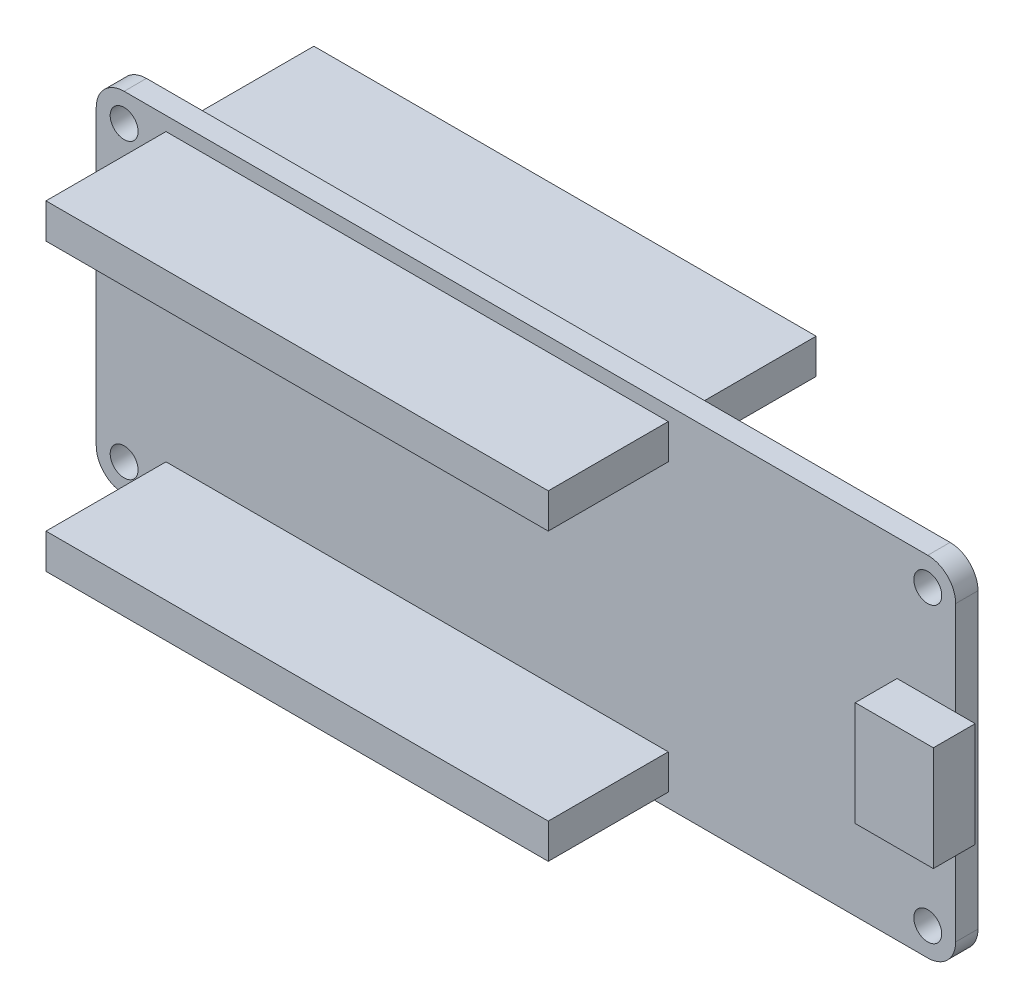
ISO-10303-21;
HEADER;
FILE_DESCRIPTION(('STEP AP214'),'2;1');
FILE_NAME('part.step','',(''),(''),'','','');
FILE_SCHEMA(('AUTOMOTIVE_DESIGN { 1 0 10303 214 1 1 1 1 }'));
ENDSEC;
DATA;
#1=APPLICATION_CONTEXT('core data for automotive mechanical design processes');
#2=APPLICATION_PROTOCOL_DEFINITION('international standard','automotive_design',2000,#1);
#3=PRODUCT_CONTEXT('',#1,'mechanical');
#4=PRODUCT('Part','Part','',(#3));
#5=PRODUCT_RELATED_PRODUCT_CATEGORY('part','',(#4));
#6=PRODUCT_DEFINITION_FORMATION('','',#4);
#7=PRODUCT_DEFINITION_CONTEXT('part definition',#1,'design');
#8=PRODUCT_DEFINITION('design','',#6,#7);
#9=PRODUCT_DEFINITION_SHAPE('','',#8);
#10=(LENGTH_UNIT() NAMED_UNIT(*) SI_UNIT(.MILLI.,.METRE.));
#11=(NAMED_UNIT(*) PLANE_ANGLE_UNIT() SI_UNIT($,.RADIAN.));
#12=(NAMED_UNIT(*) SI_UNIT($,.STERADIAN.) SOLID_ANGLE_UNIT());
#13=UNCERTAINTY_MEASURE_WITH_UNIT(LENGTH_MEASURE(1.E-05),#10,'distance_accuracy_value','');
#14=(GEOMETRIC_REPRESENTATION_CONTEXT(3) GLOBAL_UNCERTAINTY_ASSIGNED_CONTEXT((#13)) GLOBAL_UNIT_ASSIGNED_CONTEXT((#10,
#11,#12)) REPRESENTATION_CONTEXT('',''));
#15=CARTESIAN_POINT('',(0.,0.,0.));
#16=DIRECTION('',(0.,0.,1.));
#17=DIRECTION('',(1.,0.,0.));
#18=AXIS2_PLACEMENT_3D('',#15,#16,#17);
#19=CARTESIAN_POINT('',(0.,0.,1.6));
#20=DIRECTION('',(0.,0.,-1.));
#21=DIRECTION('',(-1.,0.,0.));
#22=AXIS2_PLACEMENT_3D('',#19,#20,#21);
#23=PLANE('',#22);
#24=DIRECTION('',(-1.,0.,0.));
#25=VECTOR('',#24,1.);
#26=CARTESIAN_POINT('',(0.,-11.5,1.6));
#27=LINE('',#26,#25);
#28=CARTESIAN_POINT('',(10.2,-11.5,1.6));
#29=VERTEX_POINT('',#28);
#30=CARTESIAN_POINT('',(-25.8,-11.5,1.6));
#31=VERTEX_POINT('',#30);
#32=EDGE_CURVE('E270',#29,#31,#27,.T.);
#33=ORIENTED_EDGE('',*,*,#32,.T.);
#34=DIRECTION('',(0.,1.,0.));
#35=VECTOR('',#34,1.);
#36=CARTESIAN_POINT('',(-25.8,0.,1.6));
#37=LINE('',#36,#35);
#38=CARTESIAN_POINT('',(-25.8,-9.,1.6));
#39=VERTEX_POINT('',#38);
#40=EDGE_CURVE('E279',#31,#39,#37,.T.);
#41=ORIENTED_EDGE('',*,*,#40,.T.);
#42=DIRECTION('',(1.,0.,0.));
#43=VECTOR('',#42,1.);
#44=CARTESIAN_POINT('',(0.,-9.,1.6));
#45=LINE('',#44,#43);
#46=CARTESIAN_POINT('',(10.2,-9.,1.6));
#47=VERTEX_POINT('',#46);
#48=EDGE_CURVE('E276',#39,#47,#45,.T.);
#49=ORIENTED_EDGE('',*,*,#48,.T.);
#50=DIRECTION('',(0.,-1.,0.));
#51=VECTOR('',#50,1.);
#52=CARTESIAN_POINT('',(10.2,0.,1.6));
#53=LINE('',#52,#51);
#54=EDGE_CURVE('E273',#47,#29,#53,.T.);
#55=ORIENTED_EDGE('',*,*,#54,.T.);
#56=EDGE_LOOP('',(#33,#41,#49,#55));
#57=FACE_BOUND('',#56,.T.);
#58=DIRECTION('',(-1.,0.,0.));
#59=VECTOR('',#58,1.);
#60=CARTESIAN_POINT('',(0.,9.,1.6));
#61=LINE('',#60,#59);
#62=CARTESIAN_POINT('',(10.2,9.,1.6));
#63=VERTEX_POINT('',#62);
#64=CARTESIAN_POINT('',(-25.8,9.,1.6));
#65=VERTEX_POINT('',#64);
#66=EDGE_CURVE('E310',#63,#65,#61,.T.);
#67=ORIENTED_EDGE('',*,*,#66,.T.);
#68=DIRECTION('',(0.,1.,0.));
#69=VECTOR('',#68,1.);
#70=CARTESIAN_POINT('',(-25.8,0.,1.6));
#71=LINE('',#70,#69);
#72=CARTESIAN_POINT('',(-25.8,11.5,1.6));
#73=VERTEX_POINT('',#72);
#74=EDGE_CURVE('E331',#65,#73,#71,.T.);
#75=ORIENTED_EDGE('',*,*,#74,.T.);
#76=DIRECTION('',(1.,0.,0.));
#77=VECTOR('',#76,1.);
#78=CARTESIAN_POINT('',(0.,11.5,1.6));
#79=LINE('',#78,#77);
#80=CARTESIAN_POINT('',(10.2,11.5,1.6));
#81=VERTEX_POINT('',#80);
#82=EDGE_CURVE('E328',#73,#81,#79,.T.);
#83=ORIENTED_EDGE('',*,*,#82,.T.);
#84=DIRECTION('',(0.,-1.,0.));
#85=VECTOR('',#84,1.);
#86=CARTESIAN_POINT('',(10.2,0.,1.6));
#87=LINE('',#86,#85);
#88=EDGE_CURVE('E325',#81,#63,#87,.T.);
#89=ORIENTED_EDGE('',*,*,#88,.T.);
#90=EDGE_LOOP('',(#67,#75,#83,#89));
#91=FACE_BOUND('',#90,.T.);
#92=CARTESIAN_POINT('',(-28.8,10.5,1.6));
#93=DIRECTION('',(0.,0.,1.));
#94=DIRECTION('',(1.,0.,0.));
#95=AXIS2_PLACEMENT_3D('',#92,#93,#94);
#96=CIRCLE('',#95,1.);
#97=CARTESIAN_POINT('',(-27.8,10.5,1.6));
#98=VERTEX_POINT('',#97);
#99=EDGE_CURVE('E372',#98,#98,#96,.T.);
#100=ORIENTED_EDGE('',*,*,#99,.F.);
#101=EDGE_LOOP('',(#100));
#102=FACE_BOUND('',#101,.T.);
#103=CARTESIAN_POINT('',(28.8,10.5,1.6));
#104=DIRECTION('',(0.,0.,1.));
#105=DIRECTION('',(1.,0.,0.));
#106=AXIS2_PLACEMENT_3D('',#103,#104,#105);
#107=CIRCLE('',#106,1.);
#108=CARTESIAN_POINT('',(29.8,10.5,1.6));
#109=VERTEX_POINT('',#108);
#110=EDGE_CURVE('E369',#109,#109,#107,.T.);
#111=ORIENTED_EDGE('',*,*,#110,.F.);
#112=EDGE_LOOP('',(#111));
#113=FACE_BOUND('',#112,.T.);
#114=CARTESIAN_POINT('',(28.8,-10.5,1.6));
#115=DIRECTION('',(0.,0.,1.));
#116=DIRECTION('',(1.,0.,0.));
#117=AXIS2_PLACEMENT_3D('',#114,#115,#116);
#118=CIRCLE('',#117,1.);
#119=CARTESIAN_POINT('',(29.8,-10.5,1.6));
#120=VERTEX_POINT('',#119);
#121=EDGE_CURVE('E376',#120,#120,#118,.T.);
#122=ORIENTED_EDGE('',*,*,#121,.F.);
#123=EDGE_LOOP('',(#122));
#124=FACE_BOUND('',#123,.T.);
#125=CARTESIAN_POINT('',(-28.8,-10.5,1.6));
#126=DIRECTION('',(0.,0.,1.));
#127=DIRECTION('',(1.,0.,0.));
#128=AXIS2_PLACEMENT_3D('',#125,#126,#127);
#129=CIRCLE('',#128,1.);
#130=CARTESIAN_POINT('',(-27.8,-10.5,1.6));
#131=VERTEX_POINT('',#130);
#132=EDGE_CURVE('E382',#131,#131,#129,.T.);
#133=ORIENTED_EDGE('',*,*,#132,.F.);
#134=EDGE_LOOP('',(#133));
#135=FACE_BOUND('',#134,.T.);
#136=DIRECTION('',(-1.,0.,0.));
#137=VECTOR('',#136,1.);
#138=CARTESIAN_POINT('',(26.6,3.75,1.6));
#139=LINE('',#138,#137);
#140=CARTESIAN_POINT('',(30.8,3.75,1.6));
#141=VERTEX_POINT('',#140);
#142=CARTESIAN_POINT('',(26.6,3.75,1.6));
#143=VERTEX_POINT('',#142);
#144=EDGE_CURVE('E356',#141,#143,#139,.T.);
#145=ORIENTED_EDGE('',*,*,#144,.F.);
#146=DIRECTION('',(0.,1.,0.));
#147=VECTOR('',#146,1.);
#148=CARTESIAN_POINT('',(30.8,-12.5,1.6));
#149=LINE('',#148,#147);
#150=CARTESIAN_POINT('',(30.8,10.5,1.6));
#151=VERTEX_POINT('',#150);
#152=EDGE_CURVE('E400',#141,#151,#149,.T.);
#153=ORIENTED_EDGE('',*,*,#152,.T.);
#154=CARTESIAN_POINT('',(28.8,10.5,1.6));
#155=DIRECTION('',(0.,0.,-1.));
#156=DIRECTION('',(-1.,0.,0.));
#157=AXIS2_PLACEMENT_3D('',#154,#155,#156);
#158=CIRCLE('',#157,2.);
#159=CARTESIAN_POINT('',(28.8,12.5,1.6));
#160=VERTEX_POINT('',#159);
#161=EDGE_CURVE('E440',#151,#160,#158,.F.);
#162=ORIENTED_EDGE('',*,*,#161,.T.);
#163=DIRECTION('',(-1.,0.,0.));
#164=VECTOR('',#163,1.);
#165=CARTESIAN_POINT('',(-30.8,12.5,1.6));
#166=LINE('',#165,#164);
#167=CARTESIAN_POINT('',(-28.8,12.5,1.6));
#168=VERTEX_POINT('',#167);
#169=EDGE_CURVE('E403',#160,#168,#166,.T.);
#170=ORIENTED_EDGE('',*,*,#169,.T.);
#171=CARTESIAN_POINT('',(-28.8,10.5,1.6));
#172=DIRECTION('',(0.,0.,-1.));
#173=DIRECTION('',(-1.,0.,0.));
#174=AXIS2_PLACEMENT_3D('',#171,#172,#173);
#175=CIRCLE('',#174,2.);
#176=CARTESIAN_POINT('',(-30.8,10.5,1.6));
#177=VERTEX_POINT('',#176);
#178=EDGE_CURVE('E436',#168,#177,#175,.F.);
#179=ORIENTED_EDGE('',*,*,#178,.T.);
#180=DIRECTION('',(0.,-1.,0.));
#181=VECTOR('',#180,1.);
#182=CARTESIAN_POINT('',(-30.8,-12.5,1.6));
#183=LINE('',#182,#181);
#184=CARTESIAN_POINT('',(-30.8,-10.5,1.6));
#185=VERTEX_POINT('',#184);
#186=EDGE_CURVE('E393',#177,#185,#183,.T.);
#187=ORIENTED_EDGE('',*,*,#186,.T.);
#188=CARTESIAN_POINT('',(-28.8,-10.5,1.6));
#189=DIRECTION('',(0.,0.,-1.));
#190=DIRECTION('',(-1.,0.,0.));
#191=AXIS2_PLACEMENT_3D('',#188,#189,#190);
#192=CIRCLE('',#191,2.);
#193=CARTESIAN_POINT('',(-28.8,-12.5,1.6));
#194=VERTEX_POINT('',#193);
#195=EDGE_CURVE('E438',#185,#194,#192,.F.);
#196=ORIENTED_EDGE('',*,*,#195,.T.);
#197=DIRECTION('',(1.,0.,0.));
#198=VECTOR('',#197,1.);
#199=CARTESIAN_POINT('',(-30.8,-12.5,1.6));
#200=LINE('',#199,#198);
#201=CARTESIAN_POINT('',(28.8,-12.5,1.6));
#202=VERTEX_POINT('',#201);
#203=EDGE_CURVE('E396',#194,#202,#200,.T.);
#204=ORIENTED_EDGE('',*,*,#203,.T.);
#205=CARTESIAN_POINT('',(28.8,-10.5,1.6));
#206=DIRECTION('',(0.,0.,-1.));
#207=DIRECTION('',(-1.,0.,0.));
#208=AXIS2_PLACEMENT_3D('',#205,#206,#207);
#209=CIRCLE('',#208,2.);
#210=CARTESIAN_POINT('',(30.8,-10.5,1.6));
#211=VERTEX_POINT('',#210);
#212=EDGE_CURVE('E442',#202,#211,#209,.F.);
#213=ORIENTED_EDGE('',*,*,#212,.T.);
#214=CARTESIAN_POINT('',(30.8,-3.75,1.6));
#215=VERTEX_POINT('',#214);
#216=EDGE_CURVE('E401',#211,#215,#149,.T.);
#217=ORIENTED_EDGE('',*,*,#216,.T.);
#218=DIRECTION('',(1.,0.,0.));
#219=VECTOR('',#218,1.);
#220=CARTESIAN_POINT('',(26.6,-3.75,1.6));
#221=LINE('',#220,#219);
#222=CARTESIAN_POINT('',(26.6,-3.75,1.6));
#223=VERTEX_POINT('',#222);
#224=EDGE_CURVE('E349',#223,#215,#221,.T.);
#225=ORIENTED_EDGE('',*,*,#224,.F.);
#226=DIRECTION('',(0.,-1.,0.));
#227=VECTOR('',#226,1.);
#228=CARTESIAN_POINT('',(26.6,-3.75,1.6));
#229=LINE('',#228,#227);
#230=EDGE_CURVE('E334',#143,#223,#229,.T.);
#231=ORIENTED_EDGE('',*,*,#230,.F.);
#232=EDGE_LOOP('',(#145,#153,#162,#170,#179,#187,#196,#204,#213,#217,#225,#231));
#233=FACE_BOUND('',#232,.T.);
#234=ADVANCED_FACE('F38',(#57,#91,#102,#113,#124,#135,#233),#23,.F.);
#235=CARTESIAN_POINT('',(-30.8,-12.5,1.6));
#236=DIRECTION('',(1.,0.,0.));
#237=DIRECTION('',(0.,0.,-1.));
#238=AXIS2_PLACEMENT_3D('',#235,#236,#237);
#239=PLANE('',#238);
#240=DIRECTION('',(0.,-1.,0.));
#241=VECTOR('',#240,1.);
#242=CARTESIAN_POINT('',(-30.8,-12.5,0.));
#243=LINE('',#242,#241);
#244=CARTESIAN_POINT('',(-30.8,10.5,0.));
#245=VERTEX_POINT('',#244);
#246=CARTESIAN_POINT('',(-30.8,-10.5,0.));
#247=VERTEX_POINT('',#246);
#248=EDGE_CURVE('E390',#245,#247,#243,.T.);
#249=ORIENTED_EDGE('',*,*,#248,.T.);
#250=DIRECTION('',(0.,0.,-1.));
#251=VECTOR('',#250,1.);
#252=CARTESIAN_POINT('',(-30.8,-10.5,1.6));
#253=LINE('',#252,#251);
#254=EDGE_CURVE('E452',#247,#185,#253,.F.);
#255=ORIENTED_EDGE('',*,*,#254,.T.);
#256=ORIENTED_EDGE('',*,*,#186,.F.);
#257=DIRECTION('',(0.,0.,-1.));
#258=VECTOR('',#257,1.);
#259=CARTESIAN_POINT('',(-30.8,10.5,1.6));
#260=LINE('',#259,#258);
#261=EDGE_CURVE('E449',#177,#245,#260,.T.);
#262=ORIENTED_EDGE('',*,*,#261,.T.);
#263=EDGE_LOOP('',(#249,#255,#256,#262));
#264=FACE_BOUND('',#263,.T.);
#265=ADVANCED_FACE('F506',(#264),#239,.F.);
#266=CARTESIAN_POINT('',(-30.8,-12.5,1.6));
#267=DIRECTION('',(0.,1.,0.));
#268=DIRECTION('',(0.,0.,1.));
#269=AXIS2_PLACEMENT_3D('',#266,#267,#268);
#270=PLANE('',#269);
#271=DIRECTION('',(1.,0.,0.));
#272=VECTOR('',#271,1.);
#273=CARTESIAN_POINT('',(-30.8,-12.5,0.));
#274=LINE('',#273,#272);
#275=CARTESIAN_POINT('',(-28.8,-12.5,0.));
#276=VERTEX_POINT('',#275);
#277=CARTESIAN_POINT('',(28.8,-12.5,0.));
#278=VERTEX_POINT('',#277);
#279=EDGE_CURVE('E410',#276,#278,#274,.T.);
#280=ORIENTED_EDGE('',*,*,#279,.T.);
#281=DIRECTION('',(0.,0.,-1.));
#282=VECTOR('',#281,1.);
#283=CARTESIAN_POINT('',(28.8,-12.5,1.6));
#284=LINE('',#283,#282);
#285=EDGE_CURVE('E434',#278,#202,#284,.F.);
#286=ORIENTED_EDGE('',*,*,#285,.T.);
#287=ORIENTED_EDGE('',*,*,#203,.F.);
#288=DIRECTION('',(0.,0.,-1.));
#289=VECTOR('',#288,1.);
#290=CARTESIAN_POINT('',(-28.8,-12.5,1.6));
#291=LINE('',#290,#289);
#292=EDGE_CURVE('E431',#194,#276,#291,.T.);
#293=ORIENTED_EDGE('',*,*,#292,.T.);
#294=EDGE_LOOP('',(#280,#286,#287,#293));
#295=FACE_BOUND('',#294,.T.);
#296=ADVANCED_FACE('F511',(#295),#270,.F.);
#297=CARTESIAN_POINT('',(30.8,-12.5,1.6));
#298=DIRECTION('',(-1.,0.,0.));
#299=DIRECTION('',(0.,0.,1.));
#300=AXIS2_PLACEMENT_3D('',#297,#298,#299);
#301=PLANE('',#300);
#302=ORIENTED_EDGE('',*,*,#216,.F.);
#303=DIRECTION('',(0.,0.,-1.));
#304=VECTOR('',#303,1.);
#305=CARTESIAN_POINT('',(30.8,-10.5,1.6));
#306=LINE('',#305,#304);
#307=CARTESIAN_POINT('',(30.8,-10.5,0.));
#308=VERTEX_POINT('',#307);
#309=EDGE_CURVE('E420',#211,#308,#306,.T.);
#310=ORIENTED_EDGE('',*,*,#309,.T.);
#311=DIRECTION('',(0.,1.,0.));
#312=VECTOR('',#311,1.);
#313=CARTESIAN_POINT('',(30.8,-12.5,0.));
#314=LINE('',#313,#312);
#315=CARTESIAN_POINT('',(30.8,10.5,0.));
#316=VERTEX_POINT('',#315);
#317=EDGE_CURVE('E413',#308,#316,#314,.T.);
#318=ORIENTED_EDGE('',*,*,#317,.T.);
#319=DIRECTION('',(0.,0.,-1.));
#320=VECTOR('',#319,1.);
#321=CARTESIAN_POINT('',(30.8,10.5,1.6));
#322=LINE('',#321,#320);
#323=EDGE_CURVE('E407',#316,#151,#322,.F.);
#324=ORIENTED_EDGE('',*,*,#323,.T.);
#325=ORIENTED_EDGE('',*,*,#152,.F.);
#326=EDGE_CURVE('E404',#215,#141,#149,.T.);
#327=ORIENTED_EDGE('',*,*,#326,.F.);
#328=EDGE_LOOP('',(#302,#310,#318,#324,#325,#327));
#329=FACE_BOUND('',#328,.T.);
#330=ADVANCED_FACE('F524',(#329),#301,.F.);
#331=CARTESIAN_POINT('',(-30.8,12.5,1.6));
#332=DIRECTION('',(0.,-1.,0.));
#333=DIRECTION('',(0.,0.,-1.));
#334=AXIS2_PLACEMENT_3D('',#331,#332,#333);
#335=PLANE('',#334);
#336=ORIENTED_EDGE('',*,*,#169,.F.);
#337=DIRECTION('',(0.,0.,-1.));
#338=VECTOR('',#337,1.);
#339=CARTESIAN_POINT('',(28.8,12.5,1.6));
#340=LINE('',#339,#338);
#341=CARTESIAN_POINT('',(28.8,12.5,0.));
#342=VERTEX_POINT('',#341);
#343=EDGE_CURVE('E446',#160,#342,#340,.T.);
#344=ORIENTED_EDGE('',*,*,#343,.T.);
#345=DIRECTION('',(-1.,0.,0.));
#346=VECTOR('',#345,1.);
#347=CARTESIAN_POINT('',(-30.8,12.5,0.));
#348=LINE('',#347,#346);
#349=CARTESIAN_POINT('',(-28.8,12.5,0.));
#350=VERTEX_POINT('',#349);
#351=EDGE_CURVE('E397',#342,#350,#348,.T.);
#352=ORIENTED_EDGE('',*,*,#351,.T.);
#353=DIRECTION('',(0.,0.,-1.));
#354=VECTOR('',#353,1.);
#355=CARTESIAN_POINT('',(-28.8,12.5,1.6));
#356=LINE('',#355,#354);
#357=EDGE_CURVE('E444',#350,#168,#356,.F.);
#358=ORIENTED_EDGE('',*,*,#357,.T.);
#359=EDGE_LOOP('',(#336,#344,#352,#358));
#360=FACE_BOUND('',#359,.T.);
#361=ADVANCED_FACE('F521',(#360),#335,.F.);
#362=CARTESIAN_POINT('',(0.,0.,0.));
#363=DIRECTION('',(0.,0.,-1.));
#364=DIRECTION('',(-1.,0.,0.));
#365=AXIS2_PLACEMENT_3D('',#362,#363,#364);
#366=PLANE('',#365);
#367=DIRECTION('',(0.,1.,0.));
#368=VECTOR('',#367,1.);
#369=CARTESIAN_POINT('',(-25.8,0.,0.));
#370=LINE('',#369,#368);
#371=CARTESIAN_POINT('',(-25.8,-11.5,0.));
#372=VERTEX_POINT('',#371);
#373=CARTESIAN_POINT('',(-25.8,-9.,0.));
#374=VERTEX_POINT('',#373);
#375=EDGE_CURVE('E11',#372,#374,#370,.T.);
#376=ORIENTED_EDGE('',*,*,#375,.F.);
#377=DIRECTION('',(-1.,0.,0.));
#378=VECTOR('',#377,1.);
#379=CARTESIAN_POINT('',(0.,-11.5,0.));
#380=LINE('',#379,#378);
#381=CARTESIAN_POINT('',(10.2,-11.5,0.));
#382=VERTEX_POINT('',#381);
#383=EDGE_CURVE('E466',#382,#372,#380,.T.);
#384=ORIENTED_EDGE('',*,*,#383,.F.);
#385=DIRECTION('',(0.,-1.,0.));
#386=VECTOR('',#385,1.);
#387=CARTESIAN_POINT('',(10.2,0.,0.));
#388=LINE('',#387,#386);
#389=CARTESIAN_POINT('',(10.2,-9.,0.));
#390=VERTEX_POINT('',#389);
#391=EDGE_CURVE('E469',#390,#382,#388,.T.);
#392=ORIENTED_EDGE('',*,*,#391,.F.);
#393=DIRECTION('',(1.,0.,0.));
#394=VECTOR('',#393,1.);
#395=CARTESIAN_POINT('',(0.,-9.,0.));
#396=LINE('',#395,#394);
#397=EDGE_CURVE('E46',#374,#390,#396,.T.);
#398=ORIENTED_EDGE('',*,*,#397,.F.);
#399=EDGE_LOOP('',(#376,#384,#392,#398));
#400=FACE_BOUND('',#399,.T.);
#401=DIRECTION('',(0.,1.,0.));
#402=VECTOR('',#401,1.);
#403=CARTESIAN_POINT('',(-25.8,0.,0.));
#404=LINE('',#403,#402);
#405=CARTESIAN_POINT('',(-25.8,9.,0.));
#406=VERTEX_POINT('',#405);
#407=CARTESIAN_POINT('',(-25.8,11.5,0.));
#408=VERTEX_POINT('',#407);
#409=EDGE_CURVE('E463',#406,#408,#404,.T.);
#410=ORIENTED_EDGE('',*,*,#409,.F.);
#411=DIRECTION('',(-1.,0.,0.));
#412=VECTOR('',#411,1.);
#413=CARTESIAN_POINT('',(0.,9.,0.));
#414=LINE('',#413,#412);
#415=CARTESIAN_POINT('',(10.2,9.,0.));
#416=VERTEX_POINT('',#415);
#417=EDGE_CURVE('E454',#416,#406,#414,.T.);
#418=ORIENTED_EDGE('',*,*,#417,.F.);
#419=DIRECTION('',(0.,-1.,0.));
#420=VECTOR('',#419,1.);
#421=CARTESIAN_POINT('',(10.2,0.,0.));
#422=LINE('',#421,#420);
#423=CARTESIAN_POINT('',(10.2,11.5,0.));
#424=VERTEX_POINT('',#423);
#425=EDGE_CURVE('E457',#424,#416,#422,.T.);
#426=ORIENTED_EDGE('',*,*,#425,.F.);
#427=DIRECTION('',(1.,0.,0.));
#428=VECTOR('',#427,1.);
#429=CARTESIAN_POINT('',(0.,11.5,0.));
#430=LINE('',#429,#428);
#431=EDGE_CURVE('E460',#408,#424,#430,.T.);
#432=ORIENTED_EDGE('',*,*,#431,.F.);
#433=EDGE_LOOP('',(#410,#418,#426,#432));
#434=FACE_BOUND('',#433,.T.);
#435=CARTESIAN_POINT('',(-28.8,-10.5,0.));
#436=DIRECTION('',(0.,0.,1.));
#437=DIRECTION('',(1.,0.,0.));
#438=AXIS2_PLACEMENT_3D('',#435,#436,#437);
#439=CIRCLE('',#438,1.);
#440=CARTESIAN_POINT('',(-27.8,-10.5,0.));
#441=VERTEX_POINT('',#440);
#442=EDGE_CURVE('E368',#441,#441,#439,.T.);
#443=ORIENTED_EDGE('',*,*,#442,.T.);
#444=EDGE_LOOP('',(#443));
#445=FACE_BOUND('',#444,.T.);
#446=CARTESIAN_POINT('',(28.8,-10.5,0.));
#447=DIRECTION('',(0.,0.,1.));
#448=DIRECTION('',(1.,0.,0.));
#449=AXIS2_PLACEMENT_3D('',#446,#447,#448);
#450=CIRCLE('',#449,1.);
#451=CARTESIAN_POINT('',(29.8,-10.5,0.));
#452=VERTEX_POINT('',#451);
#453=EDGE_CURVE('E379',#452,#452,#450,.T.);
#454=ORIENTED_EDGE('',*,*,#453,.T.);
#455=EDGE_LOOP('',(#454));
#456=FACE_BOUND('',#455,.T.);
#457=CARTESIAN_POINT('',(28.8,10.5,0.));
#458=DIRECTION('',(0.,0.,1.));
#459=DIRECTION('',(1.,0.,0.));
#460=AXIS2_PLACEMENT_3D('',#457,#458,#459);
#461=CIRCLE('',#460,1.);
#462=CARTESIAN_POINT('',(29.8,10.5,0.));
#463=VERTEX_POINT('',#462);
#464=EDGE_CURVE('E373',#463,#463,#461,.T.);
#465=ORIENTED_EDGE('',*,*,#464,.T.);
#466=EDGE_LOOP('',(#465));
#467=FACE_BOUND('',#466,.T.);
#468=CARTESIAN_POINT('',(-28.8,10.5,0.));
#469=DIRECTION('',(0.,0.,1.));
#470=DIRECTION('',(1.,0.,0.));
#471=AXIS2_PLACEMENT_3D('',#468,#469,#470);
#472=CIRCLE('',#471,1.);
#473=CARTESIAN_POINT('',(-27.8,10.5,0.));
#474=VERTEX_POINT('',#473);
#475=EDGE_CURVE('E387',#474,#474,#472,.T.);
#476=ORIENTED_EDGE('',*,*,#475,.T.);
#477=EDGE_LOOP('',(#476));
#478=FACE_BOUND('',#477,.T.);
#479=ORIENTED_EDGE('',*,*,#317,.F.);
#480=CARTESIAN_POINT('',(28.8,-10.5,0.));
#481=DIRECTION('',(0.,0.,-1.));
#482=DIRECTION('',(-1.,0.,0.));
#483=AXIS2_PLACEMENT_3D('',#480,#481,#482);
#484=CIRCLE('',#483,2.);
#485=EDGE_CURVE('E429',#308,#278,#484,.T.);
#486=ORIENTED_EDGE('',*,*,#485,.T.);
#487=ORIENTED_EDGE('',*,*,#279,.F.);
#488=CARTESIAN_POINT('',(-28.8,-10.5,0.));
#489=DIRECTION('',(0.,0.,-1.));
#490=DIRECTION('',(-1.,0.,0.));
#491=AXIS2_PLACEMENT_3D('',#488,#489,#490);
#492=CIRCLE('',#491,2.);
#493=EDGE_CURVE('E425',#276,#247,#492,.T.);
#494=ORIENTED_EDGE('',*,*,#493,.T.);
#495=ORIENTED_EDGE('',*,*,#248,.F.);
#496=CARTESIAN_POINT('',(-28.8,10.5,0.));
#497=DIRECTION('',(0.,0.,-1.));
#498=DIRECTION('',(-1.,0.,0.));
#499=AXIS2_PLACEMENT_3D('',#496,#497,#498);
#500=CIRCLE('',#499,2.);
#501=EDGE_CURVE('E423',#245,#350,#500,.T.);
#502=ORIENTED_EDGE('',*,*,#501,.T.);
#503=ORIENTED_EDGE('',*,*,#351,.F.);
#504=CARTESIAN_POINT('',(28.8,10.5,0.));
#505=DIRECTION('',(0.,0.,-1.));
#506=DIRECTION('',(-1.,0.,0.));
#507=AXIS2_PLACEMENT_3D('',#504,#505,#506);
#508=CIRCLE('',#507,2.);
#509=EDGE_CURVE('E427',#342,#316,#508,.T.);
#510=ORIENTED_EDGE('',*,*,#509,.T.);
#511=EDGE_LOOP('',(#479,#486,#487,#494,#495,#502,#503,#510));
#512=FACE_BOUND('',#511,.T.);
#513=ADVANCED_FACE('F518',(#400,#434,#445,#456,#467,#478,#512),#366,.T.);
#514=CARTESIAN_POINT('',(-28.8,10.5,0.));
#515=DIRECTION('',(0.,0.,1.));
#516=DIRECTION('',(1.,0.,0.));
#517=AXIS2_PLACEMENT_3D('',#514,#515,#516);
#518=CYLINDRICAL_SURFACE('',#517,1.);
#519=ORIENTED_EDGE('',*,*,#475,.F.);
#520=EDGE_LOOP('',(#519));
#521=FACE_BOUND('',#520,.T.);
#522=ORIENTED_EDGE('',*,*,#99,.T.);
#523=EDGE_LOOP('',(#522));
#524=FACE_BOUND('',#523,.T.);
#525=ADVANCED_FACE('F516',(#521,#524),#518,.F.);
#526=CARTESIAN_POINT('',(28.8,10.5,0.));
#527=DIRECTION('',(0.,0.,1.));
#528=DIRECTION('',(1.,0.,0.));
#529=AXIS2_PLACEMENT_3D('',#526,#527,#528);
#530=CYLINDRICAL_SURFACE('',#529,1.);
#531=ORIENTED_EDGE('',*,*,#464,.F.);
#532=EDGE_LOOP('',(#531));
#533=FACE_BOUND('',#532,.T.);
#534=ORIENTED_EDGE('',*,*,#110,.T.);
#535=EDGE_LOOP('',(#534));
#536=FACE_BOUND('',#535,.T.);
#537=ADVANCED_FACE('F597',(#533,#536),#530,.F.);
#538=CARTESIAN_POINT('',(28.8,-10.5,0.));
#539=DIRECTION('',(0.,0.,1.));
#540=DIRECTION('',(1.,0.,0.));
#541=AXIS2_PLACEMENT_3D('',#538,#539,#540);
#542=CYLINDRICAL_SURFACE('',#541,1.);
#543=ORIENTED_EDGE('',*,*,#453,.F.);
#544=EDGE_LOOP('',(#543));
#545=FACE_BOUND('',#544,.T.);
#546=ORIENTED_EDGE('',*,*,#121,.T.);
#547=EDGE_LOOP('',(#546));
#548=FACE_BOUND('',#547,.T.);
#549=ADVANCED_FACE('F600',(#545,#548),#542,.F.);
#550=CARTESIAN_POINT('',(-28.8,-10.5,0.));
#551=DIRECTION('',(0.,0.,1.));
#552=DIRECTION('',(1.,0.,0.));
#553=AXIS2_PLACEMENT_3D('',#550,#551,#552);
#554=CYLINDRICAL_SURFACE('',#553,1.);
#555=ORIENTED_EDGE('',*,*,#442,.F.);
#556=EDGE_LOOP('',(#555));
#557=FACE_BOUND('',#556,.T.);
#558=ORIENTED_EDGE('',*,*,#132,.T.);
#559=EDGE_LOOP('',(#558));
#560=FACE_BOUND('',#559,.T.);
#561=ADVANCED_FACE('F536',(#557,#560),#554,.F.);
#562=CARTESIAN_POINT('',(28.8,-10.5,1.6));
#563=DIRECTION('',(0.,0.,-1.));
#564=DIRECTION('',(-1.,0.,0.));
#565=AXIS2_PLACEMENT_3D('',#562,#563,#564);
#566=CYLINDRICAL_SURFACE('',#565,2.);
#567=ORIENTED_EDGE('',*,*,#212,.F.);
#568=ORIENTED_EDGE('',*,*,#285,.F.);
#569=ORIENTED_EDGE('',*,*,#485,.F.);
#570=ORIENTED_EDGE('',*,*,#309,.F.);
#571=EDGE_LOOP('',(#567,#568,#569,#570));
#572=FACE_BOUND('',#571,.T.);
#573=ADVANCED_FACE('F532',(#572),#566,.T.);
#574=CARTESIAN_POINT('',(28.8,10.5,1.6));
#575=DIRECTION('',(0.,0.,-1.));
#576=DIRECTION('',(-1.,0.,0.));
#577=AXIS2_PLACEMENT_3D('',#574,#575,#576);
#578=CYLINDRICAL_SURFACE('',#577,2.);
#579=ORIENTED_EDGE('',*,*,#161,.F.);
#580=ORIENTED_EDGE('',*,*,#323,.F.);
#581=ORIENTED_EDGE('',*,*,#509,.F.);
#582=ORIENTED_EDGE('',*,*,#343,.F.);
#583=EDGE_LOOP('',(#579,#580,#581,#582));
#584=FACE_BOUND('',#583,.T.);
#585=ADVANCED_FACE('F535',(#584),#578,.T.);
#586=CARTESIAN_POINT('',(-28.8,-10.5,1.6));
#587=DIRECTION('',(0.,0.,-1.));
#588=DIRECTION('',(-1.,0.,0.));
#589=AXIS2_PLACEMENT_3D('',#586,#587,#588);
#590=CYLINDRICAL_SURFACE('',#589,2.);
#591=ORIENTED_EDGE('',*,*,#195,.F.);
#592=ORIENTED_EDGE('',*,*,#254,.F.);
#593=ORIENTED_EDGE('',*,*,#493,.F.);
#594=ORIENTED_EDGE('',*,*,#292,.F.);
#595=EDGE_LOOP('',(#591,#592,#593,#594));
#596=FACE_BOUND('',#595,.T.);
#597=ADVANCED_FACE('F539',(#596),#590,.T.);
#598=CARTESIAN_POINT('',(-28.8,10.5,1.6));
#599=DIRECTION('',(0.,0.,-1.));
#600=DIRECTION('',(-1.,0.,0.));
#601=AXIS2_PLACEMENT_3D('',#598,#599,#600);
#602=CYLINDRICAL_SURFACE('',#601,2.);
#603=ORIENTED_EDGE('',*,*,#178,.F.);
#604=ORIENTED_EDGE('',*,*,#357,.F.);
#605=ORIENTED_EDGE('',*,*,#501,.F.);
#606=ORIENTED_EDGE('',*,*,#261,.F.);
#607=EDGE_LOOP('',(#603,#604,#605,#606));
#608=FACE_BOUND('',#607,.T.);
#609=ADVANCED_FACE('F40',(#608),#602,.T.);
#610=CARTESIAN_POINT('',(26.6,-3.75,4.6));
#611=DIRECTION('',(1.,0.,0.));
#612=DIRECTION('',(0.,0.,-1.));
#613=AXIS2_PLACEMENT_3D('',#610,#611,#612);
#614=PLANE('',#613);
#615=ORIENTED_EDGE('',*,*,#230,.T.);
#616=DIRECTION('',(0.,0.,-1.));
#617=VECTOR('',#616,1.);
#618=CARTESIAN_POINT('',(26.6,-3.75,4.6));
#619=LINE('',#618,#617);
#620=CARTESIAN_POINT('',(26.6,-3.75,4.6));
#621=VERTEX_POINT('',#620);
#622=EDGE_CURVE('E365',#621,#223,#619,.T.);
#623=ORIENTED_EDGE('',*,*,#622,.F.);
#624=DIRECTION('',(0.,-1.,0.));
#625=VECTOR('',#624,1.);
#626=CARTESIAN_POINT('',(26.6,-3.75,4.6));
#627=LINE('',#626,#625);
#628=CARTESIAN_POINT('',(26.6,3.75,4.6));
#629=VERTEX_POINT('',#628);
#630=EDGE_CURVE('E335',#629,#621,#627,.T.);
#631=ORIENTED_EDGE('',*,*,#630,.F.);
#632=DIRECTION('',(0.,0.,-1.));
#633=VECTOR('',#632,1.);
#634=CARTESIAN_POINT('',(26.6,3.75,4.6));
#635=LINE('',#634,#633);
#636=EDGE_CURVE('E345',#629,#143,#635,.T.);
#637=ORIENTED_EDGE('',*,*,#636,.T.);
#638=EDGE_LOOP('',(#615,#623,#631,#637));
#639=FACE_BOUND('',#638,.T.);
#640=ADVANCED_FACE('F546',(#639),#614,.F.);
#641=CARTESIAN_POINT('',(26.6,-3.75,4.6));
#642=DIRECTION('',(0.,1.,0.));
#643=DIRECTION('',(0.,0.,1.));
#644=AXIS2_PLACEMENT_3D('',#641,#642,#643);
#645=PLANE('',#644);
#646=ORIENTED_EDGE('',*,*,#224,.T.);
#647=CARTESIAN_POINT('',(32.2,-3.75,1.6));
#648=VERTEX_POINT('',#647);
#649=EDGE_CURVE('E348',#215,#648,#221,.T.);
#650=ORIENTED_EDGE('',*,*,#649,.T.);
#651=DIRECTION('',(0.,0.,-1.));
#652=VECTOR('',#651,1.);
#653=CARTESIAN_POINT('',(32.2,-3.75,4.6));
#654=LINE('',#653,#652);
#655=CARTESIAN_POINT('',(32.2,-3.75,4.6));
#656=VERTEX_POINT('',#655);
#657=EDGE_CURVE('E362',#656,#648,#654,.T.);
#658=ORIENTED_EDGE('',*,*,#657,.F.);
#659=DIRECTION('',(1.,0.,0.));
#660=VECTOR('',#659,1.);
#661=CARTESIAN_POINT('',(26.6,-3.75,4.6));
#662=LINE('',#661,#660);
#663=EDGE_CURVE('E338',#621,#656,#662,.T.);
#664=ORIENTED_EDGE('',*,*,#663,.F.);
#665=ORIENTED_EDGE('',*,*,#622,.T.);
#666=EDGE_LOOP('',(#646,#650,#658,#664,#665));
#667=FACE_BOUND('',#666,.T.);
#668=ADVANCED_FACE('F570',(#667),#645,.F.);
#669=CARTESIAN_POINT('',(32.2,-3.75,4.6));
#670=DIRECTION('',(-1.,0.,0.));
#671=DIRECTION('',(0.,0.,1.));
#672=AXIS2_PLACEMENT_3D('',#669,#670,#671);
#673=PLANE('',#672);
#674=DIRECTION('',(0.,1.,0.));
#675=VECTOR('',#674,1.);
#676=CARTESIAN_POINT('',(32.2,-3.75,1.6));
#677=LINE('',#676,#675);
#678=CARTESIAN_POINT('',(32.2,3.75,1.6));
#679=VERTEX_POINT('',#678);
#680=EDGE_CURVE('E352',#648,#679,#677,.T.);
#681=ORIENTED_EDGE('',*,*,#680,.T.);
#682=DIRECTION('',(0.,0.,-1.));
#683=VECTOR('',#682,1.);
#684=CARTESIAN_POINT('',(32.2,3.75,4.6));
#685=LINE('',#684,#683);
#686=CARTESIAN_POINT('',(32.2,3.75,4.6));
#687=VERTEX_POINT('',#686);
#688=EDGE_CURVE('E359',#687,#679,#685,.T.);
#689=ORIENTED_EDGE('',*,*,#688,.F.);
#690=DIRECTION('',(0.,1.,0.));
#691=VECTOR('',#690,1.);
#692=CARTESIAN_POINT('',(32.2,-3.75,4.6));
#693=LINE('',#692,#691);
#694=EDGE_CURVE('E341',#656,#687,#693,.T.);
#695=ORIENTED_EDGE('',*,*,#694,.F.);
#696=ORIENTED_EDGE('',*,*,#657,.T.);
#697=EDGE_LOOP('',(#681,#689,#695,#696));
#698=FACE_BOUND('',#697,.T.);
#699=ADVANCED_FACE('F584',(#698),#673,.F.);
#700=CARTESIAN_POINT('',(26.6,3.75,4.6));
#701=DIRECTION('',(0.,-1.,0.));
#702=DIRECTION('',(0.,0.,-1.));
#703=AXIS2_PLACEMENT_3D('',#700,#701,#702);
#704=PLANE('',#703);
#705=EDGE_CURVE('E339',#679,#141,#139,.T.);
#706=ORIENTED_EDGE('',*,*,#705,.T.);
#707=ORIENTED_EDGE('',*,*,#144,.T.);
#708=ORIENTED_EDGE('',*,*,#636,.F.);
#709=DIRECTION('',(-1.,0.,0.));
#710=VECTOR('',#709,1.);
#711=CARTESIAN_POINT('',(26.6,3.75,4.6));
#712=LINE('',#711,#710);
#713=EDGE_CURVE('E343',#687,#629,#712,.T.);
#714=ORIENTED_EDGE('',*,*,#713,.F.);
#715=ORIENTED_EDGE('',*,*,#688,.T.);
#716=EDGE_LOOP('',(#706,#707,#708,#714,#715));
#717=FACE_BOUND('',#716,.T.);
#718=ADVANCED_FACE('F576',(#717),#704,.F.);
#719=CARTESIAN_POINT('',(0.,0.,4.6));
#720=DIRECTION('',(0.,0.,-1.));
#721=DIRECTION('',(-1.,0.,0.));
#722=AXIS2_PLACEMENT_3D('',#719,#720,#721);
#723=PLANE('',#722);
#724=ORIENTED_EDGE('',*,*,#630,.T.);
#725=ORIENTED_EDGE('',*,*,#663,.T.);
#726=ORIENTED_EDGE('',*,*,#694,.T.);
#727=ORIENTED_EDGE('',*,*,#713,.T.);
#728=EDGE_LOOP('',(#724,#725,#726,#727));
#729=FACE_BOUND('',#728,.T.);
#730=ADVANCED_FACE('F580',(#729),#723,.F.);
#731=CARTESIAN_POINT('',(0.,0.,1.6));
#732=DIRECTION('',(0.,0.,-1.));
#733=DIRECTION('',(-1.,0.,0.));
#734=AXIS2_PLACEMENT_3D('',#731,#732,#733);
#735=PLANE('',#734);
#736=ORIENTED_EDGE('',*,*,#649,.F.);
#737=ORIENTED_EDGE('',*,*,#326,.T.);
#738=ORIENTED_EDGE('',*,*,#705,.F.);
#739=ORIENTED_EDGE('',*,*,#680,.F.);
#740=EDGE_LOOP('',(#736,#737,#738,#739));
#741=FACE_BOUND('',#740,.T.);
#742=ADVANCED_FACE('F567',(#741),#735,.T.);
#743=CARTESIAN_POINT('',(0.,0.,-9.));
#744=DIRECTION('',(0.,0.,1.));
#745=DIRECTION('',(1.,0.,0.));
#746=AXIS2_PLACEMENT_3D('',#743,#744,#745);
#747=PLANE('',#746);
#748=DIRECTION('',(0.,-1.,0.));
#749=VECTOR('',#748,1.);
#750=CARTESIAN_POINT('',(-25.8,11.5,-9.));
#751=LINE('',#750,#749);
#752=CARTESIAN_POINT('',(-25.8,11.5,-9.));
#753=VERTEX_POINT('',#752);
#754=CARTESIAN_POINT('',(-25.8,9.,-9.));
#755=VERTEX_POINT('',#754);
#756=EDGE_CURVE('E294',#753,#755,#751,.T.);
#757=ORIENTED_EDGE('',*,*,#756,.F.);
#758=DIRECTION('',(-1.,0.,0.));
#759=VECTOR('',#758,1.);
#760=CARTESIAN_POINT('',(-25.8,11.5,-9.));
#761=LINE('',#760,#759);
#762=CARTESIAN_POINT('',(10.2,11.5,-9.));
#763=VERTEX_POINT('',#762);
#764=EDGE_CURVE('E303',#763,#753,#761,.T.);
#765=ORIENTED_EDGE('',*,*,#764,.F.);
#766=DIRECTION('',(0.,1.,0.));
#767=VECTOR('',#766,1.);
#768=CARTESIAN_POINT('',(10.2,11.5,-9.));
#769=LINE('',#768,#767);
#770=CARTESIAN_POINT('',(10.2,9.,-9.));
#771=VERTEX_POINT('',#770);
#772=EDGE_CURVE('E300',#771,#763,#769,.T.);
#773=ORIENTED_EDGE('',*,*,#772,.F.);
#774=DIRECTION('',(1.,0.,0.));
#775=VECTOR('',#774,1.);
#776=CARTESIAN_POINT('',(-25.8,9.,-9.));
#777=LINE('',#776,#775);
#778=EDGE_CURVE('E297',#755,#771,#777,.T.);
#779=ORIENTED_EDGE('',*,*,#778,.F.);
#780=EDGE_LOOP('',(#757,#765,#773,#779));
#781=FACE_BOUND('',#780,.T.);
#782=ADVANCED_FACE('F757',(#781),#747,.F.);
#783=CARTESIAN_POINT('',(-25.8,9.,-9.));
#784=DIRECTION('',(0.,-1.,0.));
#785=DIRECTION('',(0.,0.,-1.));
#786=AXIS2_PLACEMENT_3D('',#783,#784,#785);
#787=PLANE('',#786);
#788=DIRECTION('',(0.,0.,1.));
#789=VECTOR('',#788,1.);
#790=CARTESIAN_POINT('',(10.2,9.,-9.));
#791=LINE('',#790,#789);
#792=EDGE_CURVE('E316',#771,#416,#791,.T.);
#793=ORIENTED_EDGE('',*,*,#792,.T.);
#794=ORIENTED_EDGE('',*,*,#417,.T.);
#795=DIRECTION('',(0.,0.,1.));
#796=VECTOR('',#795,1.);
#797=CARTESIAN_POINT('',(-25.8,9.,-9.));
#798=LINE('',#797,#796);
#799=EDGE_CURVE('E320',#755,#406,#798,.T.);
#800=ORIENTED_EDGE('',*,*,#799,.F.);
#801=ORIENTED_EDGE('',*,*,#778,.T.);
#802=EDGE_LOOP('',(#793,#794,#800,#801));
#803=FACE_BOUND('',#802,.T.);
#804=ADVANCED_FACE('F774',(#803),#787,.T.);
#805=CARTESIAN_POINT('',(10.2,11.5,-9.));
#806=DIRECTION('',(1.,0.,0.));
#807=DIRECTION('',(0.,0.,-1.));
#808=AXIS2_PLACEMENT_3D('',#805,#806,#807);
#809=PLANE('',#808);
#810=DIRECTION('',(0.,0.,1.));
#811=VECTOR('',#810,1.);
#812=CARTESIAN_POINT('',(10.2,11.5,-9.));
#813=LINE('',#812,#811);
#814=EDGE_CURVE('E312',#763,#424,#813,.T.);
#815=ORIENTED_EDGE('',*,*,#814,.T.);
#816=ORIENTED_EDGE('',*,*,#425,.T.);
#817=ORIENTED_EDGE('',*,*,#792,.F.);
#818=ORIENTED_EDGE('',*,*,#772,.T.);
#819=EDGE_LOOP('',(#815,#816,#817,#818));
#820=FACE_BOUND('',#819,.T.);
#821=ADVANCED_FACE('F785',(#820),#809,.T.);
#822=CARTESIAN_POINT('',(-25.8,11.5,-9.));
#823=DIRECTION('',(0.,1.,0.));
#824=DIRECTION('',(-1.,0.,0.));
#825=AXIS2_PLACEMENT_3D('',#822,#823,#824);
#826=PLANE('',#825);
#827=DIRECTION('',(0.,0.,1.));
#828=VECTOR('',#827,1.);
#829=CARTESIAN_POINT('',(-25.8,11.5,-9.));
#830=LINE('',#829,#828);
#831=EDGE_CURVE('E307',#753,#408,#830,.T.);
#832=ORIENTED_EDGE('',*,*,#831,.T.);
#833=ORIENTED_EDGE('',*,*,#431,.T.);
#834=ORIENTED_EDGE('',*,*,#814,.F.);
#835=ORIENTED_EDGE('',*,*,#764,.T.);
#836=EDGE_LOOP('',(#832,#833,#834,#835));
#837=FACE_BOUND('',#836,.T.);
#838=ADVANCED_FACE('F797',(#837),#826,.T.);
#839=CARTESIAN_POINT('',(-25.8,11.5,-9.));
#840=DIRECTION('',(-1.,0.,0.));
#841=DIRECTION('',(0.,0.,1.));
#842=AXIS2_PLACEMENT_3D('',#839,#840,#841);
#843=PLANE('',#842);
#844=ORIENTED_EDGE('',*,*,#799,.T.);
#845=ORIENTED_EDGE('',*,*,#409,.T.);
#846=ORIENTED_EDGE('',*,*,#831,.F.);
#847=ORIENTED_EDGE('',*,*,#756,.T.);
#848=EDGE_LOOP('',(#844,#845,#846,#847));
#849=FACE_BOUND('',#848,.T.);
#850=ADVANCED_FACE('F809',(#849),#843,.T.);
#851=ORIENTED_EDGE('',*,*,#74,.F.);
#852=CARTESIAN_POINT('',(-25.8,9.,10.2));
#853=VERTEX_POINT('',#852);
#854=EDGE_CURVE('E306',#65,#853,#798,.T.);
#855=ORIENTED_EDGE('',*,*,#854,.T.);
#856=DIRECTION('',(0.,-1.,0.));
#857=VECTOR('',#856,1.);
#858=CARTESIAN_POINT('',(-25.8,11.5,10.2));
#859=LINE('',#858,#857);
#860=CARTESIAN_POINT('',(-25.8,11.5,10.2));
#861=VERTEX_POINT('',#860);
#862=EDGE_CURVE('E282',#861,#853,#859,.T.);
#863=ORIENTED_EDGE('',*,*,#862,.F.);
#864=EDGE_CURVE('E311',#73,#861,#830,.T.);
#865=ORIENTED_EDGE('',*,*,#864,.F.);
#866=EDGE_LOOP('',(#851,#855,#863,#865));
#867=FACE_BOUND('',#866,.T.);
#868=ADVANCED_FACE('F821',(#867),#843,.T.);
#869=ORIENTED_EDGE('',*,*,#82,.F.);
#870=ORIENTED_EDGE('',*,*,#864,.T.);
#871=DIRECTION('',(-1.,0.,0.));
#872=VECTOR('',#871,1.);
#873=CARTESIAN_POINT('',(-25.8,11.5,10.2));
#874=LINE('',#873,#872);
#875=CARTESIAN_POINT('',(10.2,11.5,10.2));
#876=VERTEX_POINT('',#875);
#877=EDGE_CURVE('E291',#876,#861,#874,.T.);
#878=ORIENTED_EDGE('',*,*,#877,.F.);
#879=EDGE_CURVE('E315',#81,#876,#813,.T.);
#880=ORIENTED_EDGE('',*,*,#879,.F.);
#881=EDGE_LOOP('',(#869,#870,#878,#880));
#882=FACE_BOUND('',#881,.T.);
#883=ADVANCED_FACE('F812',(#882),#826,.T.);
#884=ORIENTED_EDGE('',*,*,#88,.F.);
#885=ORIENTED_EDGE('',*,*,#879,.T.);
#886=DIRECTION('',(0.,1.,0.));
#887=VECTOR('',#886,1.);
#888=CARTESIAN_POINT('',(10.2,11.5,10.2));
#889=LINE('',#888,#887);
#890=CARTESIAN_POINT('',(10.2,9.,10.2));
#891=VERTEX_POINT('',#890);
#892=EDGE_CURVE('E288',#891,#876,#889,.T.);
#893=ORIENTED_EDGE('',*,*,#892,.F.);
#894=EDGE_CURVE('E319',#63,#891,#791,.T.);
#895=ORIENTED_EDGE('',*,*,#894,.F.);
#896=EDGE_LOOP('',(#884,#885,#893,#895));
#897=FACE_BOUND('',#896,.T.);
#898=ADVANCED_FACE('F800',(#897),#809,.T.);
#899=ORIENTED_EDGE('',*,*,#66,.F.);
#900=ORIENTED_EDGE('',*,*,#894,.T.);
#901=DIRECTION('',(1.,0.,0.));
#902=VECTOR('',#901,1.);
#903=CARTESIAN_POINT('',(-25.8,9.,10.2));
#904=LINE('',#903,#902);
#905=EDGE_CURVE('E285',#853,#891,#904,.T.);
#906=ORIENTED_EDGE('',*,*,#905,.F.);
#907=ORIENTED_EDGE('',*,*,#854,.F.);
#908=EDGE_LOOP('',(#899,#900,#906,#907));
#909=FACE_BOUND('',#908,.T.);
#910=ADVANCED_FACE('F788',(#909),#787,.T.);
#911=CARTESIAN_POINT('',(0.,0.,10.2));
#912=DIRECTION('',(0.,0.,1.));
#913=DIRECTION('',(1.,0.,0.));
#914=AXIS2_PLACEMENT_3D('',#911,#912,#913);
#915=PLANE('',#914);
#916=ORIENTED_EDGE('',*,*,#862,.T.);
#917=ORIENTED_EDGE('',*,*,#905,.T.);
#918=ORIENTED_EDGE('',*,*,#892,.T.);
#919=ORIENTED_EDGE('',*,*,#877,.T.);
#920=EDGE_LOOP('',(#916,#917,#918,#919));
#921=FACE_BOUND('',#920,.T.);
#922=ADVANCED_FACE('F859',(#921),#915,.T.);
#923=CARTESIAN_POINT('',(0.,0.,-9.));
#924=DIRECTION('',(0.,0.,1.));
#925=DIRECTION('',(1.,0.,0.));
#926=AXIS2_PLACEMENT_3D('',#923,#924,#925);
#927=PLANE('',#926);
#928=DIRECTION('',(0.,-1.,0.));
#929=VECTOR('',#928,1.);
#930=CARTESIAN_POINT('',(-25.8,-9.,-9.));
#931=LINE('',#930,#929);
#932=CARTESIAN_POINT('',(-25.8,-9.,-9.));
#933=VERTEX_POINT('',#932);
#934=CARTESIAN_POINT('',(-25.8,-11.5,-9.));
#935=VERTEX_POINT('',#934);
#936=EDGE_CURVE('E231',#933,#935,#931,.T.);
#937=ORIENTED_EDGE('',*,*,#936,.F.);
#938=DIRECTION('',(-1.,0.,0.));
#939=VECTOR('',#938,1.);
#940=CARTESIAN_POINT('',(-25.8,-9.,-9.));
#941=LINE('',#940,#939);
#942=CARTESIAN_POINT('',(10.2,-9.,-9.));
#943=VERTEX_POINT('',#942);
#944=EDGE_CURVE('E242',#943,#933,#941,.T.);
#945=ORIENTED_EDGE('',*,*,#944,.F.);
#946=DIRECTION('',(0.,1.,0.));
#947=VECTOR('',#946,1.);
#948=CARTESIAN_POINT('',(10.2,-9.,-9.));
#949=LINE('',#948,#947);
#950=CARTESIAN_POINT('',(10.2,-11.5,-9.));
#951=VERTEX_POINT('',#950);
#952=EDGE_CURVE('E251',#951,#943,#949,.T.);
#953=ORIENTED_EDGE('',*,*,#952,.F.);
#954=DIRECTION('',(1.,0.,0.));
#955=VECTOR('',#954,1.);
#956=CARTESIAN_POINT('',(-25.8,-11.5,-9.));
#957=LINE('',#956,#955);
#958=EDGE_CURVE('E244',#935,#951,#957,.T.);
#959=ORIENTED_EDGE('',*,*,#958,.F.);
#960=EDGE_LOOP('',(#937,#945,#953,#959));
#961=FACE_BOUND('',#960,.T.);
#962=ADVANCED_FACE('F240',(#961),#927,.F.);
#963=CARTESIAN_POINT('',(-25.8,-11.5,-9.));
#964=DIRECTION('',(0.,-1.,0.));
#965=DIRECTION('',(1.,0.,0.));
#966=AXIS2_PLACEMENT_3D('',#963,#964,#965);
#967=PLANE('',#966);
#968=DIRECTION('',(0.,0.,1.));
#969=VECTOR('',#968,1.);
#970=CARTESIAN_POINT('',(10.2,-11.5,-9.));
#971=LINE('',#970,#969);
#972=EDGE_CURVE('E475',#951,#382,#971,.T.);
#973=ORIENTED_EDGE('',*,*,#972,.T.);
#974=ORIENTED_EDGE('',*,*,#383,.T.);
#975=DIRECTION('',(0.,0.,1.));
#976=VECTOR('',#975,1.);
#977=CARTESIAN_POINT('',(-25.8,-11.5,-9.));
#978=LINE('',#977,#976);
#979=EDGE_CURVE('E252',#935,#372,#978,.T.);
#980=ORIENTED_EDGE('',*,*,#979,.F.);
#981=ORIENTED_EDGE('',*,*,#958,.T.);
#982=EDGE_LOOP('',(#973,#974,#980,#981));
#983=FACE_BOUND('',#982,.T.);
#984=ADVANCED_FACE('F502',(#983),#967,.T.);
#985=CARTESIAN_POINT('',(10.2,-9.,-9.));
#986=DIRECTION('',(1.,0.,0.));
#987=DIRECTION('',(0.,0.,-1.));
#988=AXIS2_PLACEMENT_3D('',#985,#986,#987);
#989=PLANE('',#988);
#990=DIRECTION('',(0.,0.,1.));
#991=VECTOR('',#990,1.);
#992=CARTESIAN_POINT('',(10.2,-9.,-9.));
#993=LINE('',#992,#991);
#994=EDGE_CURVE('E249',#943,#390,#993,.T.);
#995=ORIENTED_EDGE('',*,*,#994,.T.);
#996=ORIENTED_EDGE('',*,*,#391,.T.);
#997=ORIENTED_EDGE('',*,*,#972,.F.);
#998=ORIENTED_EDGE('',*,*,#952,.T.);
#999=EDGE_LOOP('',(#995,#996,#997,#998));
#1000=FACE_BOUND('',#999,.T.);
#1001=ADVANCED_FACE('F472',(#1000),#989,.T.);
#1002=CARTESIAN_POINT('',(-25.8,-9.,-9.));
#1003=DIRECTION('',(0.,1.,0.));
#1004=DIRECTION('',(0.,0.,1.));
#1005=AXIS2_PLACEMENT_3D('',#1002,#1003,#1004);
#1006=PLANE('',#1005);
#1007=DIRECTION('',(0.,0.,1.));
#1008=VECTOR('',#1007,1.);
#1009=CARTESIAN_POINT('',(-25.8,-9.,-9.));
#1010=LINE('',#1009,#1008);
#1011=EDGE_CURVE('E227',#933,#374,#1010,.T.);
#1012=ORIENTED_EDGE('',*,*,#1011,.T.);
#1013=ORIENTED_EDGE('',*,*,#397,.T.);
#1014=ORIENTED_EDGE('',*,*,#994,.F.);
#1015=ORIENTED_EDGE('',*,*,#944,.T.);
#1016=EDGE_LOOP('',(#1012,#1013,#1014,#1015));
#1017=FACE_BOUND('',#1016,.T.);
#1018=ADVANCED_FACE('F247',(#1017),#1006,.T.);
#1019=CARTESIAN_POINT('',(-25.8,-9.,-9.));
#1020=DIRECTION('',(-1.,0.,0.));
#1021=DIRECTION('',(0.,0.,1.));
#1022=AXIS2_PLACEMENT_3D('',#1019,#1020,#1021);
#1023=PLANE('',#1022);
#1024=ORIENTED_EDGE('',*,*,#979,.T.);
#1025=ORIENTED_EDGE('',*,*,#375,.T.);
#1026=ORIENTED_EDGE('',*,*,#1011,.F.);
#1027=ORIENTED_EDGE('',*,*,#936,.T.);
#1028=EDGE_LOOP('',(#1024,#1025,#1026,#1027));
#1029=FACE_BOUND('',#1028,.T.);
#1030=ADVANCED_FACE('F230',(#1029),#1023,.T.);
#1031=ORIENTED_EDGE('',*,*,#40,.F.);
#1032=CARTESIAN_POINT('',(-25.8,-11.5,10.2));
#1033=VERTEX_POINT('',#1032);
#1034=EDGE_CURVE('E53',#31,#1033,#978,.T.);
#1035=ORIENTED_EDGE('',*,*,#1034,.T.);
#1036=DIRECTION('',(0.,-1.,0.));
#1037=VECTOR('',#1036,1.);
#1038=CARTESIAN_POINT('',(-25.8,-9.,10.2));
#1039=LINE('',#1038,#1037);
#1040=CARTESIAN_POINT('',(-25.8,-9.,10.2));
#1041=VERTEX_POINT('',#1040);
#1042=EDGE_CURVE('E267',#1041,#1033,#1039,.T.);
#1043=ORIENTED_EDGE('',*,*,#1042,.F.);
#1044=EDGE_CURVE('E235',#39,#1041,#1010,.T.);
#1045=ORIENTED_EDGE('',*,*,#1044,.F.);
#1046=EDGE_LOOP('',(#1031,#1035,#1043,#1045));
#1047=FACE_BOUND('',#1046,.T.);
#1048=ADVANCED_FACE('F480',(#1047),#1023,.T.);
#1049=ORIENTED_EDGE('',*,*,#48,.F.);
#1050=ORIENTED_EDGE('',*,*,#1044,.T.);
#1051=DIRECTION('',(-1.,0.,0.));
#1052=VECTOR('',#1051,1.);
#1053=CARTESIAN_POINT('',(-25.8,-9.,10.2));
#1054=LINE('',#1053,#1052);
#1055=CARTESIAN_POINT('',(10.2,-9.,10.2));
#1056=VERTEX_POINT('',#1055);
#1057=EDGE_CURVE('E245',#1056,#1041,#1054,.T.);
#1058=ORIENTED_EDGE('',*,*,#1057,.F.);
#1059=EDGE_CURVE('E234',#47,#1056,#993,.T.);
#1060=ORIENTED_EDGE('',*,*,#1059,.F.);
#1061=EDGE_LOOP('',(#1049,#1050,#1058,#1060));
#1062=FACE_BOUND('',#1061,.T.);
#1063=ADVANCED_FACE('F490',(#1062),#1006,.T.);
#1064=ORIENTED_EDGE('',*,*,#54,.F.);
#1065=ORIENTED_EDGE('',*,*,#1059,.T.);
#1066=DIRECTION('',(0.,1.,0.));
#1067=VECTOR('',#1066,1.);
#1068=CARTESIAN_POINT('',(10.2,-9.,10.2));
#1069=LINE('',#1068,#1067);
#1070=CARTESIAN_POINT('',(10.2,-11.5,10.2));
#1071=VERTEX_POINT('',#1070);
#1072=EDGE_CURVE('E261',#1071,#1056,#1069,.T.);
#1073=ORIENTED_EDGE('',*,*,#1072,.F.);
#1074=EDGE_CURVE('E474',#29,#1071,#971,.T.);
#1075=ORIENTED_EDGE('',*,*,#1074,.F.);
#1076=EDGE_LOOP('',(#1064,#1065,#1073,#1075));
#1077=FACE_BOUND('',#1076,.T.);
#1078=ADVANCED_FACE('F494',(#1077),#989,.T.);
#1079=ORIENTED_EDGE('',*,*,#32,.F.);
#1080=ORIENTED_EDGE('',*,*,#1074,.T.);
#1081=DIRECTION('',(1.,0.,0.));
#1082=VECTOR('',#1081,1.);
#1083=CARTESIAN_POINT('',(-25.8,-11.5,10.2));
#1084=LINE('',#1083,#1082);
#1085=EDGE_CURVE('E264',#1033,#1071,#1084,.T.);
#1086=ORIENTED_EDGE('',*,*,#1085,.F.);
#1087=ORIENTED_EDGE('',*,*,#1034,.F.);
#1088=EDGE_LOOP('',(#1079,#1080,#1086,#1087));
#1089=FACE_BOUND('',#1088,.T.);
#1090=ADVANCED_FACE('F482',(#1089),#967,.T.);
#1091=CARTESIAN_POINT('',(0.,0.,10.2));
#1092=DIRECTION('',(0.,0.,1.));
#1093=DIRECTION('',(1.,0.,0.));
#1094=AXIS2_PLACEMENT_3D('',#1091,#1092,#1093);
#1095=PLANE('',#1094);
#1096=ORIENTED_EDGE('',*,*,#1042,.T.);
#1097=ORIENTED_EDGE('',*,*,#1085,.T.);
#1098=ORIENTED_EDGE('',*,*,#1072,.T.);
#1099=ORIENTED_EDGE('',*,*,#1057,.T.);
#1100=EDGE_LOOP('',(#1096,#1097,#1098,#1099));
#1101=FACE_BOUND('',#1100,.T.);
#1102=ADVANCED_FACE('F486',(#1101),#1095,.T.);
#1103=CLOSED_SHELL('',(#234,#265,#296,#330,#361,#513,#525,#537,#549,#561,#573,#585,#597,#609,
#640,#668,#699,#718,#730,#742,#782,#804,#821,#838,#850,#868,#883,#898,#910,#922,#962,#984,#1001,
#1018,#1030,#1048,#1063,#1078,#1090,#1102));
#1104=MANIFOLD_SOLID_BREP('B2',#1103);
#1105=ADVANCED_BREP_SHAPE_REPRESENTATION('',(#18,#1104),#14);
#1106=SHAPE_DEFINITION_REPRESENTATION(#9,#1105);
ENDSEC;
END-ISO-10303-21;
